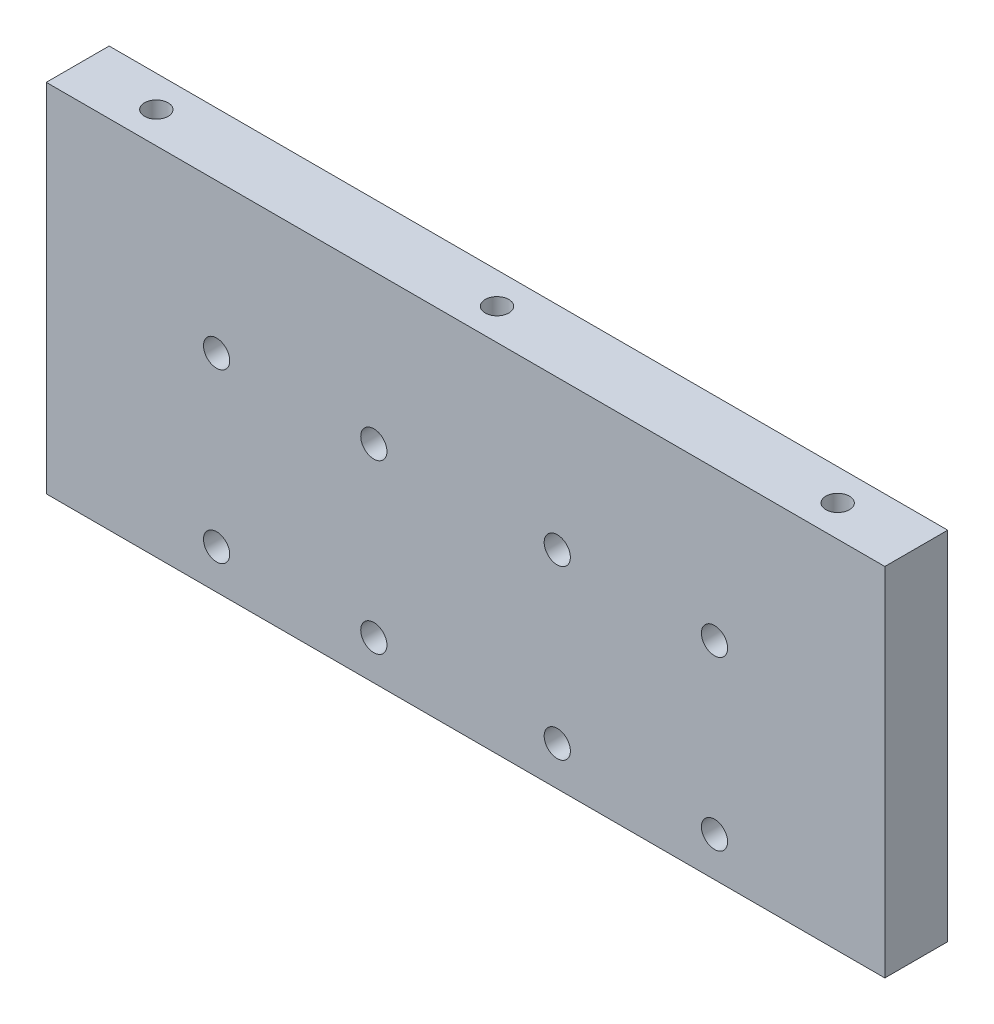
ISO-10303-21;
HEADER;
FILE_DESCRIPTION(('STEP AP214'),'2;1');
FILE_NAME('part.step','',(''),(''),'','','');
FILE_SCHEMA(('AUTOMOTIVE_DESIGN { 1 0 10303 214 1 1 1 1 }'));
ENDSEC;
DATA;
#1=APPLICATION_CONTEXT('core data for automotive mechanical design processes');
#2=APPLICATION_PROTOCOL_DEFINITION('international standard','automotive_design',2000,#1);
#3=PRODUCT_CONTEXT('',#1,'mechanical');
#4=PRODUCT('Part','Part','',(#3));
#5=PRODUCT_RELATED_PRODUCT_CATEGORY('part','',(#4));
#6=PRODUCT_DEFINITION_FORMATION('','',#4);
#7=PRODUCT_DEFINITION_CONTEXT('part definition',#1,'design');
#8=PRODUCT_DEFINITION('design','',#6,#7);
#9=PRODUCT_DEFINITION_SHAPE('','',#8);
#10=(LENGTH_UNIT() NAMED_UNIT(*) SI_UNIT(.MILLI.,.METRE.));
#11=(NAMED_UNIT(*) PLANE_ANGLE_UNIT() SI_UNIT($,.RADIAN.));
#12=(NAMED_UNIT(*) SI_UNIT($,.STERADIAN.) SOLID_ANGLE_UNIT());
#13=UNCERTAINTY_MEASURE_WITH_UNIT(LENGTH_MEASURE(1.E-05),#10,'distance_accuracy_value','');
#14=(GEOMETRIC_REPRESENTATION_CONTEXT(3) GLOBAL_UNCERTAINTY_ASSIGNED_CONTEXT((#13)) GLOBAL_UNIT_ASSIGNED_CONTEXT((#10,
#11,#12)) REPRESENTATION_CONTEXT('',''));
#15=CARTESIAN_POINT('',(0.,0.,0.));
#16=DIRECTION('',(0.,0.,1.));
#17=DIRECTION('',(1.,0.,0.));
#18=AXIS2_PLACEMENT_3D('',#15,#16,#17);
#19=CARTESIAN_POINT('',(32.5,39.4999999999998,12.));
#20=DIRECTION('',(0.,0.,-1.));
#21=DIRECTION('',(-1.,0.,0.));
#22=AXIS2_PLACEMENT_3D('',#19,#20,#21);
#23=CYLINDRICAL_SURFACE('',#22,2.50000000000001);
#24=CARTESIAN_POINT('',(32.5,39.4999999999998,12.));
#25=DIRECTION('',(0.,0.,1.));
#26=DIRECTION('',(1.,0.,0.));
#27=AXIS2_PLACEMENT_3D('',#24,#25,#26);
#28=CIRCLE('',#27,2.50000000000001);
#29=CARTESIAN_POINT('',(35.,39.4999999999998,12.));
#30=VERTEX_POINT('',#29);
#31=EDGE_CURVE('E211',#30,#30,#28,.T.);
#32=ORIENTED_EDGE('',*,*,#31,.T.);
#33=EDGE_LOOP('',(#32));
#34=FACE_BOUND('',#33,.T.);
#35=CARTESIAN_POINT('',(32.5,39.4999999999998,5.));
#36=DIRECTION('',(0.,0.,-1.));
#37=DIRECTION('',(-1.,0.,0.));
#38=AXIS2_PLACEMENT_3D('',#35,#36,#37);
#39=CIRCLE('',#38,2.50000000000001);
#40=CARTESIAN_POINT('',(30.,39.4999999999998,5.));
#41=VERTEX_POINT('',#40);
#42=EDGE_CURVE('E36',#41,#41,#39,.T.);
#43=ORIENTED_EDGE('',*,*,#42,.T.);
#44=EDGE_LOOP('',(#43));
#45=FACE_BOUND('',#44,.T.);
#46=ADVANCED_FACE('F32',(#34,#45),#23,.F.);
#47=CARTESIAN_POINT('',(32.5000000000003,7.49999999999979,12.));
#48=DIRECTION('',(0.,0.,-1.));
#49=DIRECTION('',(-1.,0.,0.));
#50=AXIS2_PLACEMENT_3D('',#47,#48,#49);
#51=CYLINDRICAL_SURFACE('',#50,2.50000000000001);
#52=CARTESIAN_POINT('',(32.5000000000003,7.49999999999979,12.));
#53=DIRECTION('',(0.,0.,1.));
#54=DIRECTION('',(1.,0.,0.));
#55=AXIS2_PLACEMENT_3D('',#52,#53,#54);
#56=CIRCLE('',#55,2.50000000000001);
#57=CARTESIAN_POINT('',(35.0000000000003,7.49999999999979,12.));
#58=VERTEX_POINT('',#57);
#59=EDGE_CURVE('E208',#58,#58,#56,.T.);
#60=ORIENTED_EDGE('',*,*,#59,.T.);
#61=EDGE_LOOP('',(#60));
#62=FACE_BOUND('',#61,.T.);
#63=CARTESIAN_POINT('',(32.5000000000003,7.49999999999979,5.));
#64=DIRECTION('',(0.,0.,-1.));
#65=DIRECTION('',(-1.,0.,0.));
#66=AXIS2_PLACEMENT_3D('',#63,#64,#65);
#67=CIRCLE('',#66,2.50000000000001);
#68=CARTESIAN_POINT('',(30.0000000000003,7.49999999999979,5.));
#69=VERTEX_POINT('',#68);
#70=EDGE_CURVE('E138',#69,#69,#67,.T.);
#71=ORIENTED_EDGE('',*,*,#70,.T.);
#72=EDGE_LOOP('',(#71));
#73=FACE_BOUND('',#72,.T.);
#74=ADVANCED_FACE('F241',(#62,#73),#51,.F.);
#75=CARTESIAN_POINT('',(62.5000000000003,7.49999999999999,12.));
#76=DIRECTION('',(0.,0.,-1.));
#77=DIRECTION('',(-1.,0.,0.));
#78=AXIS2_PLACEMENT_3D('',#75,#76,#77);
#79=CYLINDRICAL_SURFACE('',#78,2.5);
#80=CARTESIAN_POINT('',(62.5000000000003,7.49999999999999,12.));
#81=DIRECTION('',(0.,0.,1.));
#82=DIRECTION('',(1.,0.,0.));
#83=AXIS2_PLACEMENT_3D('',#80,#81,#82);
#84=CIRCLE('',#83,2.5);
#85=CARTESIAN_POINT('',(65.0000000000003,7.49999999999999,12.));
#86=VERTEX_POINT('',#85);
#87=EDGE_CURVE('E205',#86,#86,#84,.T.);
#88=ORIENTED_EDGE('',*,*,#87,.T.);
#89=EDGE_LOOP('',(#88));
#90=FACE_BOUND('',#89,.T.);
#91=CARTESIAN_POINT('',(62.5000000000003,7.49999999999999,5.));
#92=DIRECTION('',(0.,0.,-1.));
#93=DIRECTION('',(-1.,0.,0.));
#94=AXIS2_PLACEMENT_3D('',#91,#92,#93);
#95=CIRCLE('',#94,2.5);
#96=CARTESIAN_POINT('',(60.0000000000003,7.49999999999999,5.));
#97=VERTEX_POINT('',#96);
#98=EDGE_CURVE('E134',#97,#97,#95,.T.);
#99=ORIENTED_EDGE('',*,*,#98,.T.);
#100=EDGE_LOOP('',(#99));
#101=FACE_BOUND('',#100,.T.);
#102=ADVANCED_FACE('F247',(#90,#101),#79,.F.);
#103=CARTESIAN_POINT('',(97.4999999999997,7.5,12.));
#104=DIRECTION('',(0.,0.,-1.));
#105=DIRECTION('',(-1.,0.,0.));
#106=AXIS2_PLACEMENT_3D('',#103,#104,#105);
#107=CYLINDRICAL_SURFACE('',#106,2.50000000000001);
#108=CARTESIAN_POINT('',(97.4999999999997,7.5,12.));
#109=DIRECTION('',(0.,0.,1.));
#110=DIRECTION('',(-1.,0.,0.));
#111=AXIS2_PLACEMENT_3D('',#108,#109,#110);
#112=CIRCLE('',#111,2.50000000000001);
#113=CARTESIAN_POINT('',(94.9999999999997,7.5,12.));
#114=VERTEX_POINT('',#113);
#115=EDGE_CURVE('E214',#114,#114,#112,.T.);
#116=ORIENTED_EDGE('',*,*,#115,.T.);
#117=EDGE_LOOP('',(#116));
#118=FACE_BOUND('',#117,.T.);
#119=CARTESIAN_POINT('',(97.4999999999997,7.5,5.));
#120=DIRECTION('',(0.,0.,-1.));
#121=DIRECTION('',(-1.,0.,0.));
#122=AXIS2_PLACEMENT_3D('',#119,#120,#121);
#123=CIRCLE('',#122,2.50000000000001);
#124=CARTESIAN_POINT('',(94.9999999999997,7.5,5.));
#125=VERTEX_POINT('',#124);
#126=EDGE_CURVE('E129',#125,#125,#123,.T.);
#127=ORIENTED_EDGE('',*,*,#126,.T.);
#128=EDGE_LOOP('',(#127));
#129=FACE_BOUND('',#128,.T.);
#130=ADVANCED_FACE('F253',(#118,#129),#107,.F.);
#131=CARTESIAN_POINT('',(62.5,39.5,12.));
#132=DIRECTION('',(0.,0.,-1.));
#133=DIRECTION('',(-1.,0.,0.));
#134=AXIS2_PLACEMENT_3D('',#131,#132,#133);
#135=CYLINDRICAL_SURFACE('',#134,2.5);
#136=CARTESIAN_POINT('',(62.5,39.5,12.));
#137=DIRECTION('',(0.,0.,1.));
#138=DIRECTION('',(1.,0.,0.));
#139=AXIS2_PLACEMENT_3D('',#136,#137,#138);
#140=CIRCLE('',#139,2.5);
#141=CARTESIAN_POINT('',(65.,39.5,12.));
#142=VERTEX_POINT('',#141);
#143=EDGE_CURVE('E103',#142,#142,#140,.T.);
#144=ORIENTED_EDGE('',*,*,#143,.T.);
#145=EDGE_LOOP('',(#144));
#146=FACE_BOUND('',#145,.T.);
#147=CARTESIAN_POINT('',(62.5,39.5,5.));
#148=DIRECTION('',(0.,0.,-1.));
#149=DIRECTION('',(-1.,0.,0.));
#150=AXIS2_PLACEMENT_3D('',#147,#148,#149);
#151=CIRCLE('',#150,2.5);
#152=CARTESIAN_POINT('',(60.,39.5,5.));
#153=VERTEX_POINT('',#152);
#154=EDGE_CURVE('E124',#153,#153,#151,.T.);
#155=ORIENTED_EDGE('',*,*,#154,.T.);
#156=EDGE_LOOP('',(#155));
#157=FACE_BOUND('',#156,.T.);
#158=ADVANCED_FACE('F220',(#146,#157),#135,.F.);
#159=CARTESIAN_POINT('',(97.5,39.5,12.));
#160=DIRECTION('',(0.,0.,-1.));
#161=DIRECTION('',(-1.,0.,0.));
#162=AXIS2_PLACEMENT_3D('',#159,#160,#161);
#163=CYLINDRICAL_SURFACE('',#162,2.5);
#164=CARTESIAN_POINT('',(97.5,39.5,12.));
#165=DIRECTION('',(0.,0.,1.));
#166=DIRECTION('',(-1.,0.,0.));
#167=AXIS2_PLACEMENT_3D('',#164,#165,#166);
#168=CIRCLE('',#167,2.5);
#169=CARTESIAN_POINT('',(95.,39.5,12.));
#170=VERTEX_POINT('',#169);
#171=EDGE_CURVE('E194',#170,#170,#168,.T.);
#172=ORIENTED_EDGE('',*,*,#171,.T.);
#173=EDGE_LOOP('',(#172));
#174=FACE_BOUND('',#173,.T.);
#175=CARTESIAN_POINT('',(97.5,39.5,5.));
#176=DIRECTION('',(0.,0.,-1.));
#177=DIRECTION('',(-1.,0.,0.));
#178=AXIS2_PLACEMENT_3D('',#175,#176,#177);
#179=CIRCLE('',#178,2.5);
#180=CARTESIAN_POINT('',(95.,39.5,5.));
#181=VERTEX_POINT('',#180);
#182=EDGE_CURVE('E119',#181,#181,#179,.T.);
#183=ORIENTED_EDGE('',*,*,#182,.T.);
#184=EDGE_LOOP('',(#183));
#185=FACE_BOUND('',#184,.T.);
#186=ADVANCED_FACE('F257',(#174,#185),#163,.F.);
#187=CARTESIAN_POINT('',(127.5,7.4999999999998,12.));
#188=DIRECTION('',(0.,0.,-1.));
#189=DIRECTION('',(-1.,0.,0.));
#190=AXIS2_PLACEMENT_3D('',#187,#188,#189);
#191=CYLINDRICAL_SURFACE('',#190,2.5);
#192=CARTESIAN_POINT('',(127.5,7.4999999999998,12.));
#193=DIRECTION('',(0.,0.,1.));
#194=DIRECTION('',(-1.,0.,0.));
#195=AXIS2_PLACEMENT_3D('',#192,#193,#194);
#196=CIRCLE('',#195,2.5);
#197=CARTESIAN_POINT('',(125.,7.4999999999998,12.));
#198=VERTEX_POINT('',#197);
#199=EDGE_CURVE('E202',#198,#198,#196,.T.);
#200=ORIENTED_EDGE('',*,*,#199,.T.);
#201=EDGE_LOOP('',(#200));
#202=FACE_BOUND('',#201,.T.);
#203=CARTESIAN_POINT('',(127.5,7.4999999999998,5.));
#204=DIRECTION('',(0.,0.,-1.));
#205=DIRECTION('',(-1.,0.,0.));
#206=AXIS2_PLACEMENT_3D('',#203,#204,#205);
#207=CIRCLE('',#206,2.5);
#208=CARTESIAN_POINT('',(125.,7.4999999999998,5.));
#209=VERTEX_POINT('',#208);
#210=EDGE_CURVE('E114',#209,#209,#207,.T.);
#211=ORIENTED_EDGE('',*,*,#210,.T.);
#212=EDGE_LOOP('',(#211));
#213=FACE_BOUND('',#212,.T.);
#214=ADVANCED_FACE('F234',(#202,#213),#191,.F.);
#215=CARTESIAN_POINT('',(127.5,39.4999999999998,12.));
#216=DIRECTION('',(0.,0.,-1.));
#217=DIRECTION('',(-1.,0.,0.));
#218=AXIS2_PLACEMENT_3D('',#215,#216,#217);
#219=CYLINDRICAL_SURFACE('',#218,2.5);
#220=CARTESIAN_POINT('',(127.5,39.4999999999998,12.));
#221=DIRECTION('',(0.,0.,1.));
#222=DIRECTION('',(-1.,0.,0.));
#223=AXIS2_PLACEMENT_3D('',#220,#221,#222);
#224=CIRCLE('',#223,2.5);
#225=CARTESIAN_POINT('',(125.,39.4999999999998,12.));
#226=VERTEX_POINT('',#225);
#227=EDGE_CURVE('E199',#226,#226,#224,.T.);
#228=ORIENTED_EDGE('',*,*,#227,.T.);
#229=EDGE_LOOP('',(#228));
#230=FACE_BOUND('',#229,.T.);
#231=CARTESIAN_POINT('',(127.5,39.4999999999998,5.));
#232=DIRECTION('',(0.,0.,-1.));
#233=DIRECTION('',(-1.,0.,0.));
#234=AXIS2_PLACEMENT_3D('',#231,#232,#233);
#235=CIRCLE('',#234,2.5);
#236=CARTESIAN_POINT('',(125.,39.4999999999998,5.));
#237=VERTEX_POINT('',#236);
#238=EDGE_CURVE('E109',#237,#237,#235,.T.);
#239=ORIENTED_EDGE('',*,*,#238,.T.);
#240=EDGE_LOOP('',(#239));
#241=FACE_BOUND('',#240,.T.);
#242=ADVANCED_FACE('F225',(#230,#241),#219,.F.);
#243=CARTESIAN_POINT('',(0.,0.,12.));
#244=DIRECTION('',(0.,0.,-1.));
#245=DIRECTION('',(-1.,0.,0.));
#246=AXIS2_PLACEMENT_3D('',#243,#244,#245);
#247=PLANE('',#246);
#248=ORIENTED_EDGE('',*,*,#227,.F.);
#249=EDGE_LOOP('',(#248));
#250=FACE_BOUND('',#249,.T.);
#251=ORIENTED_EDGE('',*,*,#87,.F.);
#252=EDGE_LOOP('',(#251));
#253=FACE_BOUND('',#252,.T.);
#254=ORIENTED_EDGE('',*,*,#31,.F.);
#255=EDGE_LOOP('',(#254));
#256=FACE_BOUND('',#255,.T.);
#257=ORIENTED_EDGE('',*,*,#143,.F.);
#258=EDGE_LOOP('',(#257));
#259=FACE_BOUND('',#258,.T.);
#260=DIRECTION('',(0.,-1.,0.));
#261=VECTOR('',#260,1.);
#262=CARTESIAN_POINT('',(0.,0.,12.));
#263=LINE('',#262,#261);
#264=CARTESIAN_POINT('',(0.,68.,12.));
#265=VERTEX_POINT('',#264);
#266=CARTESIAN_POINT('',(0.,0.,12.));
#267=VERTEX_POINT('',#266);
#268=EDGE_CURVE('E87',#265,#267,#263,.T.);
#269=ORIENTED_EDGE('',*,*,#268,.T.);
#270=DIRECTION('',(1.,0.,0.));
#271=VECTOR('',#270,1.);
#272=CARTESIAN_POINT('',(0.,0.,12.));
#273=LINE('',#272,#271);
#274=CARTESIAN_POINT('',(160.,0.,12.));
#275=VERTEX_POINT('',#274);
#276=EDGE_CURVE('E81',#267,#275,#273,.T.);
#277=ORIENTED_EDGE('',*,*,#276,.T.);
#278=DIRECTION('',(0.,1.,0.));
#279=VECTOR('',#278,1.);
#280=CARTESIAN_POINT('',(160.,0.,12.));
#281=LINE('',#280,#279);
#282=CARTESIAN_POINT('',(160.,68.,12.));
#283=VERTEX_POINT('',#282);
#284=EDGE_CURVE('E85',#275,#283,#281,.T.);
#285=ORIENTED_EDGE('',*,*,#284,.T.);
#286=DIRECTION('',(-1.,0.,0.));
#287=VECTOR('',#286,1.);
#288=CARTESIAN_POINT('',(0.,68.,12.));
#289=LINE('',#288,#287);
#290=EDGE_CURVE('E51',#283,#265,#289,.T.);
#291=ORIENTED_EDGE('',*,*,#290,.T.);
#292=EDGE_LOOP('',(#269,#277,#285,#291));
#293=FACE_BOUND('',#292,.T.);
#294=ORIENTED_EDGE('',*,*,#115,.F.);
#295=EDGE_LOOP('',(#294));
#296=FACE_BOUND('',#295,.T.);
#297=ORIENTED_EDGE('',*,*,#59,.F.);
#298=EDGE_LOOP('',(#297));
#299=FACE_BOUND('',#298,.T.);
#300=ORIENTED_EDGE('',*,*,#199,.F.);
#301=EDGE_LOOP('',(#300));
#302=FACE_BOUND('',#301,.T.);
#303=ORIENTED_EDGE('',*,*,#171,.F.);
#304=EDGE_LOOP('',(#303));
#305=FACE_BOUND('',#304,.T.);
#306=ADVANCED_FACE('F82',(#250,#253,#256,#259,#293,#296,#299,#302,#305),#247,.F.);
#307=CARTESIAN_POINT('',(0.,0.,0.));
#308=DIRECTION('',(0.,0.,-1.));
#309=DIRECTION('',(-1.,0.,0.));
#310=AXIS2_PLACEMENT_3D('',#307,#308,#309);
#311=PLANE('',#310);
#312=CARTESIAN_POINT('',(32.5000000000003,39.5,0.));
#313=DIRECTION('',(0.,0.,-1.));
#314=DIRECTION('',(-1.,0.,0.));
#315=AXIS2_PLACEMENT_3D('',#312,#313,#314);
#316=CIRCLE('',#315,4.5);
#317=CARTESIAN_POINT('',(28.0000000000003,39.5,0.));
#318=VERTEX_POINT('',#317);
#319=EDGE_CURVE('E154',#318,#318,#316,.T.);
#320=ORIENTED_EDGE('',*,*,#319,.F.);
#321=EDGE_LOOP('',(#320));
#322=FACE_BOUND('',#321,.T.);
#323=CARTESIAN_POINT('',(32.5000000000003,7.49999999999979,0.));
#324=DIRECTION('',(0.,0.,-1.));
#325=DIRECTION('',(-1.,0.,0.));
#326=AXIS2_PLACEMENT_3D('',#323,#324,#325);
#327=CIRCLE('',#326,4.5);
#328=CARTESIAN_POINT('',(28.0000000000003,7.49999999999979,0.));
#329=VERTEX_POINT('',#328);
#330=EDGE_CURVE('E147',#329,#329,#327,.T.);
#331=ORIENTED_EDGE('',*,*,#330,.F.);
#332=EDGE_LOOP('',(#331));
#333=FACE_BOUND('',#332,.T.);
#334=CARTESIAN_POINT('',(62.5000000000003,7.49999999999999,0.));
#335=DIRECTION('',(0.,0.,-1.));
#336=DIRECTION('',(-1.,0.,0.));
#337=AXIS2_PLACEMENT_3D('',#334,#335,#336);
#338=CIRCLE('',#337,4.5);
#339=CARTESIAN_POINT('',(58.0000000000003,7.49999999999999,0.));
#340=VERTEX_POINT('',#339);
#341=EDGE_CURVE('E140',#340,#340,#338,.T.);
#342=ORIENTED_EDGE('',*,*,#341,.F.);
#343=EDGE_LOOP('',(#342));
#344=FACE_BOUND('',#343,.T.);
#345=CARTESIAN_POINT('',(97.4999999999997,7.5,0.));
#346=DIRECTION('',(0.,0.,-1.));
#347=DIRECTION('',(-1.,0.,0.));
#348=AXIS2_PLACEMENT_3D('',#345,#346,#347);
#349=CIRCLE('',#348,4.5);
#350=CARTESIAN_POINT('',(92.9999999999997,7.5,0.));
#351=VERTEX_POINT('',#350);
#352=EDGE_CURVE('E136',#351,#351,#349,.T.);
#353=ORIENTED_EDGE('',*,*,#352,.F.);
#354=EDGE_LOOP('',(#353));
#355=FACE_BOUND('',#354,.T.);
#356=CARTESIAN_POINT('',(62.5,39.5,0.));
#357=DIRECTION('',(0.,0.,-1.));
#358=DIRECTION('',(-1.,0.,0.));
#359=AXIS2_PLACEMENT_3D('',#356,#357,#358);
#360=CIRCLE('',#359,4.5);
#361=CARTESIAN_POINT('',(58.,39.5,0.));
#362=VERTEX_POINT('',#361);
#363=EDGE_CURVE('E132',#362,#362,#360,.T.);
#364=ORIENTED_EDGE('',*,*,#363,.F.);
#365=EDGE_LOOP('',(#364));
#366=FACE_BOUND('',#365,.T.);
#367=CARTESIAN_POINT('',(97.5,39.5,0.));
#368=DIRECTION('',(0.,0.,-1.));
#369=DIRECTION('',(-1.,0.,0.));
#370=AXIS2_PLACEMENT_3D('',#367,#368,#369);
#371=CIRCLE('',#370,4.50000000000001);
#372=CARTESIAN_POINT('',(93.,39.5,0.));
#373=VERTEX_POINT('',#372);
#374=EDGE_CURVE('E127',#373,#373,#371,.T.);
#375=ORIENTED_EDGE('',*,*,#374,.F.);
#376=EDGE_LOOP('',(#375));
#377=FACE_BOUND('',#376,.T.);
#378=CARTESIAN_POINT('',(127.5,7.4999999999998,0.));
#379=DIRECTION('',(0.,0.,-1.));
#380=DIRECTION('',(-1.,0.,0.));
#381=AXIS2_PLACEMENT_3D('',#378,#379,#380);
#382=CIRCLE('',#381,4.50000000000001);
#383=CARTESIAN_POINT('',(123.,7.4999999999998,0.));
#384=VERTEX_POINT('',#383);
#385=EDGE_CURVE('E122',#384,#384,#382,.T.);
#386=ORIENTED_EDGE('',*,*,#385,.F.);
#387=EDGE_LOOP('',(#386));
#388=FACE_BOUND('',#387,.T.);
#389=CARTESIAN_POINT('',(127.5,39.4999999999998,0.));
#390=DIRECTION('',(0.,0.,-1.));
#391=DIRECTION('',(-1.,0.,0.));
#392=AXIS2_PLACEMENT_3D('',#389,#390,#391);
#393=CIRCLE('',#392,4.50000000000001);
#394=CARTESIAN_POINT('',(123.,39.4999999999998,0.));
#395=VERTEX_POINT('',#394);
#396=EDGE_CURVE('E117',#395,#395,#393,.T.);
#397=ORIENTED_EDGE('',*,*,#396,.F.);
#398=EDGE_LOOP('',(#397));
#399=FACE_BOUND('',#398,.T.);
#400=DIRECTION('',(0.,-1.,0.));
#401=VECTOR('',#400,1.);
#402=CARTESIAN_POINT('',(0.,0.,0.));
#403=LINE('',#402,#401);
#404=CARTESIAN_POINT('',(0.,68.,0.));
#405=VERTEX_POINT('',#404);
#406=CARTESIAN_POINT('',(0.,0.,0.));
#407=VERTEX_POINT('',#406);
#408=EDGE_CURVE('E100',#405,#407,#403,.T.);
#409=ORIENTED_EDGE('',*,*,#408,.F.);
#410=DIRECTION('',(-1.,0.,0.));
#411=VECTOR('',#410,1.);
#412=CARTESIAN_POINT('',(0.,68.,0.));
#413=LINE('',#412,#411);
#414=CARTESIAN_POINT('',(160.,68.,0.));
#415=VERTEX_POINT('',#414);
#416=EDGE_CURVE('E74',#415,#405,#413,.T.);
#417=ORIENTED_EDGE('',*,*,#416,.F.);
#418=DIRECTION('',(0.,1.,0.));
#419=VECTOR('',#418,1.);
#420=CARTESIAN_POINT('',(160.,0.,0.));
#421=LINE('',#420,#419);
#422=CARTESIAN_POINT('',(160.,0.,0.));
#423=VERTEX_POINT('',#422);
#424=EDGE_CURVE('E68',#423,#415,#421,.T.);
#425=ORIENTED_EDGE('',*,*,#424,.F.);
#426=DIRECTION('',(1.,0.,0.));
#427=VECTOR('',#426,1.);
#428=CARTESIAN_POINT('',(0.,0.,0.));
#429=LINE('',#428,#427);
#430=EDGE_CURVE('E91',#407,#423,#429,.T.);
#431=ORIENTED_EDGE('',*,*,#430,.F.);
#432=EDGE_LOOP('',(#409,#417,#425,#431));
#433=FACE_BOUND('',#432,.T.);
#434=ADVANCED_FACE('F224',(#322,#333,#344,#355,#366,#377,#388,#399,#433),#311,.T.);
#435=CARTESIAN_POINT('',(0.,0.,12.));
#436=DIRECTION('',(1.,0.,0.));
#437=DIRECTION('',(0.,1.,0.));
#438=AXIS2_PLACEMENT_3D('',#435,#436,#437);
#439=PLANE('',#438);
#440=ORIENTED_EDGE('',*,*,#408,.T.);
#441=DIRECTION('',(0.,0.,-1.));
#442=VECTOR('',#441,1.);
#443=CARTESIAN_POINT('',(0.,0.,12.));
#444=LINE('',#443,#442);
#445=EDGE_CURVE('E11',#267,#407,#444,.T.);
#446=ORIENTED_EDGE('',*,*,#445,.F.);
#447=ORIENTED_EDGE('',*,*,#268,.F.);
#448=DIRECTION('',(0.,0.,-1.));
#449=VECTOR('',#448,1.);
#450=CARTESIAN_POINT('',(0.,68.,12.));
#451=LINE('',#450,#449);
#452=EDGE_CURVE('E96',#265,#405,#451,.T.);
#453=ORIENTED_EDGE('',*,*,#452,.T.);
#454=EDGE_LOOP('',(#440,#446,#447,#453));
#455=FACE_BOUND('',#454,.T.);
#456=ADVANCED_FACE('F34',(#455),#439,.F.);
#457=CARTESIAN_POINT('',(0.,0.,12.));
#458=DIRECTION('',(0.,1.,0.));
#459=DIRECTION('',(0.,0.,1.));
#460=AXIS2_PLACEMENT_3D('',#457,#458,#459);
#461=PLANE('',#460);
#462=ORIENTED_EDGE('',*,*,#430,.T.);
#463=DIRECTION('',(0.,0.,-1.));
#464=VECTOR('',#463,1.);
#465=CARTESIAN_POINT('',(160.,0.,12.));
#466=LINE('',#465,#464);
#467=EDGE_CURVE('E42',#275,#423,#466,.T.);
#468=ORIENTED_EDGE('',*,*,#467,.F.);
#469=ORIENTED_EDGE('',*,*,#276,.F.);
#470=ORIENTED_EDGE('',*,*,#445,.T.);
#471=EDGE_LOOP('',(#462,#468,#469,#470));
#472=FACE_BOUND('',#471,.T.);
#473=ADVANCED_FACE('F90',(#472),#461,.F.);
#474=CARTESIAN_POINT('',(160.,0.,12.));
#475=DIRECTION('',(-1.,0.,0.));
#476=DIRECTION('',(0.,-1.,0.));
#477=AXIS2_PLACEMENT_3D('',#474,#475,#476);
#478=PLANE('',#477);
#479=ORIENTED_EDGE('',*,*,#424,.T.);
#480=DIRECTION('',(0.,0.,-1.));
#481=VECTOR('',#480,1.);
#482=CARTESIAN_POINT('',(160.,68.,12.));
#483=LINE('',#482,#481);
#484=EDGE_CURVE('E92',#283,#415,#483,.T.);
#485=ORIENTED_EDGE('',*,*,#484,.F.);
#486=ORIENTED_EDGE('',*,*,#284,.F.);
#487=ORIENTED_EDGE('',*,*,#467,.T.);
#488=EDGE_LOOP('',(#479,#485,#486,#487));
#489=FACE_BOUND('',#488,.T.);
#490=ADVANCED_FACE('F94',(#489),#478,.F.);
#491=CARTESIAN_POINT('',(0.,68.,12.));
#492=DIRECTION('',(0.,-1.,0.));
#493=DIRECTION('',(0.,0.,-1.));
#494=AXIS2_PLACEMENT_3D('',#491,#492,#493);
#495=PLANE('',#494);
#496=CARTESIAN_POINT('',(145.,68.,6.));
#497=DIRECTION('',(0.,1.,0.));
#498=DIRECTION('',(0.,0.,1.));
#499=AXIS2_PLACEMENT_3D('',#496,#497,#498);
#500=CIRCLE('',#499,2.24999999999998);
#501=CARTESIAN_POINT('',(145.,68.,8.24999999999998));
#502=VERTEX_POINT('',#501);
#503=EDGE_CURVE('E112',#502,#502,#500,.T.);
#504=ORIENTED_EDGE('',*,*,#503,.F.);
#505=EDGE_LOOP('',(#504));
#506=FACE_BOUND('',#505,.T.);
#507=CARTESIAN_POINT('',(80.,68.,6.));
#508=DIRECTION('',(0.,1.,0.));
#509=DIRECTION('',(0.,0.,1.));
#510=AXIS2_PLACEMENT_3D('',#507,#508,#509);
#511=CIRCLE('',#510,2.25);
#512=CARTESIAN_POINT('',(80.,68.,8.25));
#513=VERTEX_POINT('',#512);
#514=EDGE_CURVE('E182',#513,#513,#511,.T.);
#515=ORIENTED_EDGE('',*,*,#514,.F.);
#516=EDGE_LOOP('',(#515));
#517=FACE_BOUND('',#516,.T.);
#518=CARTESIAN_POINT('',(15.,68.,6.));
#519=DIRECTION('',(0.,1.,0.));
#520=DIRECTION('',(0.,0.,1.));
#521=AXIS2_PLACEMENT_3D('',#518,#519,#520);
#522=CIRCLE('',#521,2.25);
#523=CARTESIAN_POINT('',(15.,68.,8.25));
#524=VERTEX_POINT('',#523);
#525=EDGE_CURVE('E188',#524,#524,#522,.T.);
#526=ORIENTED_EDGE('',*,*,#525,.F.);
#527=EDGE_LOOP('',(#526));
#528=FACE_BOUND('',#527,.T.);
#529=ORIENTED_EDGE('',*,*,#416,.T.);
#530=ORIENTED_EDGE('',*,*,#452,.F.);
#531=ORIENTED_EDGE('',*,*,#290,.F.);
#532=ORIENTED_EDGE('',*,*,#484,.T.);
#533=EDGE_LOOP('',(#529,#530,#531,#532));
#534=FACE_BOUND('',#533,.T.);
#535=ADVANCED_FACE('F307',(#506,#517,#528,#534),#495,.F.);
#536=CARTESIAN_POINT('',(15.,53.,6.));
#537=DIRECTION('',(0.,1.,0.));
#538=DIRECTION('',(0.,0.,1.));
#539=AXIS2_PLACEMENT_3D('',#536,#537,#538);
#540=CYLINDRICAL_SURFACE('',#539,2.25);
#541=CARTESIAN_POINT('',(15.,53.,6.));
#542=DIRECTION('',(0.,1.,0.));
#543=DIRECTION('',(0.,0.,1.));
#544=AXIS2_PLACEMENT_3D('',#541,#542,#543);
#545=CIRCLE('',#544,2.25);
#546=CARTESIAN_POINT('',(15.,53.,8.25));
#547=VERTEX_POINT('',#546);
#548=EDGE_CURVE('E191',#547,#547,#545,.T.);
#549=ORIENTED_EDGE('',*,*,#548,.F.);
#550=EDGE_LOOP('',(#549));
#551=FACE_BOUND('',#550,.T.);
#552=ORIENTED_EDGE('',*,*,#525,.T.);
#553=EDGE_LOOP('',(#552));
#554=FACE_BOUND('',#553,.T.);
#555=ADVANCED_FACE('F270',(#551,#554),#540,.F.);
#556=CARTESIAN_POINT('',(15.,53.,6.));
#557=DIRECTION('',(0.,1.,0.));
#558=DIRECTION('',(0.,0.,1.));
#559=AXIS2_PLACEMENT_3D('',#556,#557,#558);
#560=PLANE('',#559);
#561=ORIENTED_EDGE('',*,*,#548,.T.);
#562=EDGE_LOOP('',(#561));
#563=FACE_BOUND('',#562,.T.);
#564=ADVANCED_FACE('F315',(#563),#560,.T.);
#565=CARTESIAN_POINT('',(80.,53.,6.));
#566=DIRECTION('',(0.,1.,0.));
#567=DIRECTION('',(0.,0.,1.));
#568=AXIS2_PLACEMENT_3D('',#565,#566,#567);
#569=CYLINDRICAL_SURFACE('',#568,2.25);
#570=CARTESIAN_POINT('',(80.,53.,6.));
#571=DIRECTION('',(0.,1.,0.));
#572=DIRECTION('',(0.,0.,1.));
#573=AXIS2_PLACEMENT_3D('',#570,#571,#572);
#574=CIRCLE('',#573,2.25);
#575=CARTESIAN_POINT('',(80.,53.,8.25));
#576=VERTEX_POINT('',#575);
#577=EDGE_CURVE('E185',#576,#576,#574,.T.);
#578=ORIENTED_EDGE('',*,*,#577,.F.);
#579=EDGE_LOOP('',(#578));
#580=FACE_BOUND('',#579,.T.);
#581=ORIENTED_EDGE('',*,*,#514,.T.);
#582=EDGE_LOOP('',(#581));
#583=FACE_BOUND('',#582,.T.);
#584=ADVANCED_FACE('F504',(#580,#583),#569,.F.);
#585=CARTESIAN_POINT('',(80.,53.,6.));
#586=DIRECTION('',(0.,1.,0.));
#587=DIRECTION('',(0.,0.,1.));
#588=AXIS2_PLACEMENT_3D('',#585,#586,#587);
#589=PLANE('',#588);
#590=ORIENTED_EDGE('',*,*,#577,.T.);
#591=EDGE_LOOP('',(#590));
#592=FACE_BOUND('',#591,.T.);
#593=ADVANCED_FACE('F500',(#592),#589,.T.);
#594=CARTESIAN_POINT('',(145.,53.,6.));
#595=DIRECTION('',(0.,1.,0.));
#596=DIRECTION('',(0.,0.,1.));
#597=AXIS2_PLACEMENT_3D('',#594,#595,#596);
#598=CYLINDRICAL_SURFACE('',#597,2.24999999999998);
#599=CARTESIAN_POINT('',(145.,53.,6.));
#600=DIRECTION('',(0.,1.,0.));
#601=DIRECTION('',(0.,0.,1.));
#602=AXIS2_PLACEMENT_3D('',#599,#600,#601);
#603=CIRCLE('',#602,2.24999999999998);
#604=CARTESIAN_POINT('',(145.,53.,8.24999999999998));
#605=VERTEX_POINT('',#604);
#606=EDGE_CURVE('E179',#605,#605,#603,.T.);
#607=ORIENTED_EDGE('',*,*,#606,.F.);
#608=EDGE_LOOP('',(#607));
#609=FACE_BOUND('',#608,.T.);
#610=ORIENTED_EDGE('',*,*,#503,.T.);
#611=EDGE_LOOP('',(#610));
#612=FACE_BOUND('',#611,.T.);
#613=ADVANCED_FACE('F496',(#609,#612),#598,.F.);
#614=CARTESIAN_POINT('',(145.,53.,6.));
#615=DIRECTION('',(0.,1.,0.));
#616=DIRECTION('',(0.,0.,1.));
#617=AXIS2_PLACEMENT_3D('',#614,#615,#616);
#618=PLANE('',#617);
#619=ORIENTED_EDGE('',*,*,#606,.T.);
#620=EDGE_LOOP('',(#619));
#621=FACE_BOUND('',#620,.T.);
#622=ADVANCED_FACE('F346',(#621),#618,.T.);
#623=CARTESIAN_POINT('',(127.5,39.4999999999998,5.));
#624=DIRECTION('',(0.,0.,-1.));
#625=DIRECTION('',(-1.,0.,0.));
#626=AXIS2_PLACEMENT_3D('',#623,#624,#625);
#627=CYLINDRICAL_SURFACE('',#626,4.50000000000001);
#628=CARTESIAN_POINT('',(127.5,39.4999999999998,5.));
#629=DIRECTION('',(0.,0.,-1.));
#630=DIRECTION('',(-1.,0.,0.));
#631=AXIS2_PLACEMENT_3D('',#628,#629,#630);
#632=CIRCLE('',#631,4.50000000000001);
#633=CARTESIAN_POINT('',(123.,39.4999999999998,5.));
#634=VERTEX_POINT('',#633);
#635=EDGE_CURVE('E113',#634,#634,#632,.T.);
#636=ORIENTED_EDGE('',*,*,#635,.F.);
#637=EDGE_LOOP('',(#636));
#638=FACE_BOUND('',#637,.T.);
#639=ORIENTED_EDGE('',*,*,#396,.T.);
#640=EDGE_LOOP('',(#639));
#641=FACE_BOUND('',#640,.T.);
#642=ADVANCED_FACE('F340',(#638,#641),#627,.F.);
#643=CARTESIAN_POINT('',(127.5,39.4999999999998,5.));
#644=DIRECTION('',(0.,0.,-1.));
#645=DIRECTION('',(-1.,0.,0.));
#646=AXIS2_PLACEMENT_3D('',#643,#644,#645);
#647=PLANE('',#646);
#648=ORIENTED_EDGE('',*,*,#238,.F.);
#649=EDGE_LOOP('',(#648));
#650=FACE_BOUND('',#649,.T.);
#651=ORIENTED_EDGE('',*,*,#635,.T.);
#652=EDGE_LOOP('',(#651));
#653=FACE_BOUND('',#652,.T.);
#654=ADVANCED_FACE('F345',(#650,#653),#647,.T.);
#655=CARTESIAN_POINT('',(127.5,7.4999999999998,5.));
#656=DIRECTION('',(0.,0.,-1.));
#657=DIRECTION('',(-1.,0.,0.));
#658=AXIS2_PLACEMENT_3D('',#655,#656,#657);
#659=CYLINDRICAL_SURFACE('',#658,4.50000000000001);
#660=CARTESIAN_POINT('',(127.5,7.4999999999998,5.));
#661=DIRECTION('',(0.,0.,-1.));
#662=DIRECTION('',(-1.,0.,0.));
#663=AXIS2_PLACEMENT_3D('',#660,#661,#662);
#664=CIRCLE('',#663,4.50000000000001);
#665=CARTESIAN_POINT('',(123.,7.4999999999998,5.));
#666=VERTEX_POINT('',#665);
#667=EDGE_CURVE('E118',#666,#666,#664,.T.);
#668=ORIENTED_EDGE('',*,*,#667,.F.);
#669=EDGE_LOOP('',(#668));
#670=FACE_BOUND('',#669,.T.);
#671=ORIENTED_EDGE('',*,*,#385,.T.);
#672=EDGE_LOOP('',(#671));
#673=FACE_BOUND('',#672,.T.);
#674=ADVANCED_FACE('F358',(#670,#673),#659,.F.);
#675=CARTESIAN_POINT('',(127.5,7.4999999999998,5.));
#676=DIRECTION('',(0.,0.,-1.));
#677=DIRECTION('',(-1.,0.,0.));
#678=AXIS2_PLACEMENT_3D('',#675,#676,#677);
#679=PLANE('',#678);
#680=ORIENTED_EDGE('',*,*,#210,.F.);
#681=EDGE_LOOP('',(#680));
#682=FACE_BOUND('',#681,.T.);
#683=ORIENTED_EDGE('',*,*,#667,.T.);
#684=EDGE_LOOP('',(#683));
#685=FACE_BOUND('',#684,.T.);
#686=ADVANCED_FACE('F368',(#682,#685),#679,.T.);
#687=CARTESIAN_POINT('',(97.5,39.5,5.));
#688=DIRECTION('',(0.,0.,-1.));
#689=DIRECTION('',(-1.,0.,0.));
#690=AXIS2_PLACEMENT_3D('',#687,#688,#689);
#691=CYLINDRICAL_SURFACE('',#690,4.50000000000001);
#692=CARTESIAN_POINT('',(97.5,39.5,5.));
#693=DIRECTION('',(0.,0.,-1.));
#694=DIRECTION('',(-1.,0.,0.));
#695=AXIS2_PLACEMENT_3D('',#692,#693,#694);
#696=CIRCLE('',#695,4.50000000000001);
#697=CARTESIAN_POINT('',(93.,39.5,5.));
#698=VERTEX_POINT('',#697);
#699=EDGE_CURVE('E123',#698,#698,#696,.T.);
#700=ORIENTED_EDGE('',*,*,#699,.F.);
#701=EDGE_LOOP('',(#700));
#702=FACE_BOUND('',#701,.T.);
#703=ORIENTED_EDGE('',*,*,#374,.T.);
#704=EDGE_LOOP('',(#703));
#705=FACE_BOUND('',#704,.T.);
#706=ADVANCED_FACE('F378',(#702,#705),#691,.F.);
#707=CARTESIAN_POINT('',(97.5,39.5,5.));
#708=DIRECTION('',(0.,0.,-1.));
#709=DIRECTION('',(-1.,0.,0.));
#710=AXIS2_PLACEMENT_3D('',#707,#708,#709);
#711=PLANE('',#710);
#712=ORIENTED_EDGE('',*,*,#182,.F.);
#713=EDGE_LOOP('',(#712));
#714=FACE_BOUND('',#713,.T.);
#715=ORIENTED_EDGE('',*,*,#699,.T.);
#716=EDGE_LOOP('',(#715));
#717=FACE_BOUND('',#716,.T.);
#718=ADVANCED_FACE('F388',(#714,#717),#711,.T.);
#719=CARTESIAN_POINT('',(62.5,39.5,5.));
#720=DIRECTION('',(0.,0.,-1.));
#721=DIRECTION('',(-1.,0.,0.));
#722=AXIS2_PLACEMENT_3D('',#719,#720,#721);
#723=CYLINDRICAL_SURFACE('',#722,4.5);
#724=CARTESIAN_POINT('',(62.5,39.5,5.));
#725=DIRECTION('',(0.,0.,-1.));
#726=DIRECTION('',(-1.,0.,0.));
#727=AXIS2_PLACEMENT_3D('',#724,#725,#726);
#728=CIRCLE('',#727,4.5);
#729=CARTESIAN_POINT('',(58.,39.5,5.));
#730=VERTEX_POINT('',#729);
#731=EDGE_CURVE('E128',#730,#730,#728,.T.);
#732=ORIENTED_EDGE('',*,*,#731,.F.);
#733=EDGE_LOOP('',(#732));
#734=FACE_BOUND('',#733,.T.);
#735=ORIENTED_EDGE('',*,*,#363,.T.);
#736=EDGE_LOOP('',(#735));
#737=FACE_BOUND('',#736,.T.);
#738=ADVANCED_FACE('F398',(#734,#737),#723,.F.);
#739=CARTESIAN_POINT('',(62.5,39.5,5.));
#740=DIRECTION('',(0.,0.,-1.));
#741=DIRECTION('',(-1.,0.,0.));
#742=AXIS2_PLACEMENT_3D('',#739,#740,#741);
#743=PLANE('',#742);
#744=ORIENTED_EDGE('',*,*,#154,.F.);
#745=EDGE_LOOP('',(#744));
#746=FACE_BOUND('',#745,.T.);
#747=ORIENTED_EDGE('',*,*,#731,.T.);
#748=EDGE_LOOP('',(#747));
#749=FACE_BOUND('',#748,.T.);
#750=ADVANCED_FACE('F408',(#746,#749),#743,.T.);
#751=CARTESIAN_POINT('',(97.4999999999997,7.5,5.));
#752=DIRECTION('',(0.,0.,-1.));
#753=DIRECTION('',(-1.,0.,0.));
#754=AXIS2_PLACEMENT_3D('',#751,#752,#753);
#755=CYLINDRICAL_SURFACE('',#754,4.5);
#756=CARTESIAN_POINT('',(97.4999999999997,7.5,5.));
#757=DIRECTION('',(0.,0.,-1.));
#758=DIRECTION('',(-1.,0.,0.));
#759=AXIS2_PLACEMENT_3D('',#756,#757,#758);
#760=CIRCLE('',#759,4.5);
#761=CARTESIAN_POINT('',(92.9999999999997,7.5,5.));
#762=VERTEX_POINT('',#761);
#763=EDGE_CURVE('E133',#762,#762,#760,.T.);
#764=ORIENTED_EDGE('',*,*,#763,.F.);
#765=EDGE_LOOP('',(#764));
#766=FACE_BOUND('',#765,.T.);
#767=ORIENTED_EDGE('',*,*,#352,.T.);
#768=EDGE_LOOP('',(#767));
#769=FACE_BOUND('',#768,.T.);
#770=ADVANCED_FACE('F418',(#766,#769),#755,.F.);
#771=CARTESIAN_POINT('',(97.4999999999997,7.5,5.));
#772=DIRECTION('',(0.,0.,-1.));
#773=DIRECTION('',(-1.,0.,0.));
#774=AXIS2_PLACEMENT_3D('',#771,#772,#773);
#775=PLANE('',#774);
#776=ORIENTED_EDGE('',*,*,#126,.F.);
#777=EDGE_LOOP('',(#776));
#778=FACE_BOUND('',#777,.T.);
#779=ORIENTED_EDGE('',*,*,#763,.T.);
#780=EDGE_LOOP('',(#779));
#781=FACE_BOUND('',#780,.T.);
#782=ADVANCED_FACE('F290',(#778,#781),#775,.T.);
#783=CARTESIAN_POINT('',(62.5000000000003,7.49999999999999,5.));
#784=DIRECTION('',(0.,0.,-1.));
#785=DIRECTION('',(-1.,0.,0.));
#786=AXIS2_PLACEMENT_3D('',#783,#784,#785);
#787=CYLINDRICAL_SURFACE('',#786,4.5);
#788=CARTESIAN_POINT('',(62.5000000000003,7.49999999999999,5.));
#789=DIRECTION('',(0.,0.,-1.));
#790=DIRECTION('',(-1.,0.,0.));
#791=AXIS2_PLACEMENT_3D('',#788,#789,#790);
#792=CIRCLE('',#791,4.5);
#793=CARTESIAN_POINT('',(58.0000000000003,7.49999999999999,5.));
#794=VERTEX_POINT('',#793);
#795=EDGE_CURVE('E137',#794,#794,#792,.T.);
#796=ORIENTED_EDGE('',*,*,#795,.F.);
#797=EDGE_LOOP('',(#796));
#798=FACE_BOUND('',#797,.T.);
#799=ORIENTED_EDGE('',*,*,#341,.T.);
#800=EDGE_LOOP('',(#799));
#801=FACE_BOUND('',#800,.T.);
#802=ADVANCED_FACE('F284',(#798,#801),#787,.F.);
#803=CARTESIAN_POINT('',(62.5000000000003,7.49999999999999,5.));
#804=DIRECTION('',(0.,0.,-1.));
#805=DIRECTION('',(-1.,0.,0.));
#806=AXIS2_PLACEMENT_3D('',#803,#804,#805);
#807=PLANE('',#806);
#808=ORIENTED_EDGE('',*,*,#98,.F.);
#809=EDGE_LOOP('',(#808));
#810=FACE_BOUND('',#809,.T.);
#811=ORIENTED_EDGE('',*,*,#795,.T.);
#812=EDGE_LOOP('',(#811));
#813=FACE_BOUND('',#812,.T.);
#814=ADVANCED_FACE('F280',(#810,#813),#807,.T.);
#815=CARTESIAN_POINT('',(32.5000000000003,7.49999999999979,5.));
#816=DIRECTION('',(0.,0.,-1.));
#817=DIRECTION('',(-1.,0.,0.));
#818=AXIS2_PLACEMENT_3D('',#815,#816,#817);
#819=CYLINDRICAL_SURFACE('',#818,4.5);
#820=CARTESIAN_POINT('',(32.5000000000003,7.49999999999979,5.));
#821=DIRECTION('',(0.,0.,-1.));
#822=DIRECTION('',(-1.,0.,0.));
#823=AXIS2_PLACEMENT_3D('',#820,#821,#822);
#824=CIRCLE('',#823,4.5);
#825=CARTESIAN_POINT('',(28.0000000000003,7.49999999999979,5.));
#826=VERTEX_POINT('',#825);
#827=EDGE_CURVE('E141',#826,#826,#824,.T.);
#828=ORIENTED_EDGE('',*,*,#827,.F.);
#829=EDGE_LOOP('',(#828));
#830=FACE_BOUND('',#829,.T.);
#831=ORIENTED_EDGE('',*,*,#330,.T.);
#832=EDGE_LOOP('',(#831));
#833=FACE_BOUND('',#832,.T.);
#834=ADVANCED_FACE('F283',(#830,#833),#819,.F.);
#835=CARTESIAN_POINT('',(32.5000000000003,7.49999999999979,5.));
#836=DIRECTION('',(0.,0.,-1.));
#837=DIRECTION('',(-1.,0.,0.));
#838=AXIS2_PLACEMENT_3D('',#835,#836,#837);
#839=PLANE('',#838);
#840=ORIENTED_EDGE('',*,*,#70,.F.);
#841=EDGE_LOOP('',(#840));
#842=FACE_BOUND('',#841,.T.);
#843=ORIENTED_EDGE('',*,*,#827,.T.);
#844=EDGE_LOOP('',(#843));
#845=FACE_BOUND('',#844,.T.);
#846=ADVANCED_FACE('F458',(#842,#845),#839,.T.);
#847=CARTESIAN_POINT('',(32.5000000000003,39.5,5.));
#848=DIRECTION('',(0.,0.,-1.));
#849=DIRECTION('',(-1.,0.,0.));
#850=AXIS2_PLACEMENT_3D('',#847,#848,#849);
#851=CYLINDRICAL_SURFACE('',#850,4.5);
#852=CARTESIAN_POINT('',(32.5000000000003,39.5,5.));
#853=DIRECTION('',(0.,0.,-1.));
#854=DIRECTION('',(-1.,0.,0.));
#855=AXIS2_PLACEMENT_3D('',#852,#853,#854);
#856=CIRCLE('',#855,4.5);
#857=CARTESIAN_POINT('',(28.0000000000003,39.5,5.));
#858=VERTEX_POINT('',#857);
#859=EDGE_CURVE('E609',#858,#858,#856,.T.);
#860=ORIENTED_EDGE('',*,*,#859,.F.);
#861=EDGE_LOOP('',(#860));
#862=FACE_BOUND('',#861,.T.);
#863=ORIENTED_EDGE('',*,*,#319,.T.);
#864=EDGE_LOOP('',(#863));
#865=FACE_BOUND('',#864,.T.);
#866=ADVANCED_FACE('F468',(#862,#865),#851,.F.);
#867=CARTESIAN_POINT('',(32.5000000000003,39.5,5.));
#868=DIRECTION('',(0.,0.,-1.));
#869=DIRECTION('',(-1.,0.,0.));
#870=AXIS2_PLACEMENT_3D('',#867,#868,#869);
#871=PLANE('',#870);
#872=ORIENTED_EDGE('',*,*,#42,.F.);
#873=EDGE_LOOP('',(#872));
#874=FACE_BOUND('',#873,.T.);
#875=ORIENTED_EDGE('',*,*,#859,.T.);
#876=EDGE_LOOP('',(#875));
#877=FACE_BOUND('',#876,.T.);
#878=ADVANCED_FACE('F478',(#874,#877),#871,.T.);
#879=CLOSED_SHELL('',(#46,#74,#102,#130,#158,#186,#214,#242,#306,#434,#456,#473,#490,#535,#555,
#564,#584,#593,#613,#622,#642,#654,#674,#686,#706,#718,#738,#750,#770,#782,#802,#814,#834,#846,
#866,#878));
#880=MANIFOLD_SOLID_BREP('B2',#879);
#881=ADVANCED_BREP_SHAPE_REPRESENTATION('',(#18,#880),#14);
#882=SHAPE_DEFINITION_REPRESENTATION(#9,#881);
ENDSEC;
END-ISO-10303-21;
